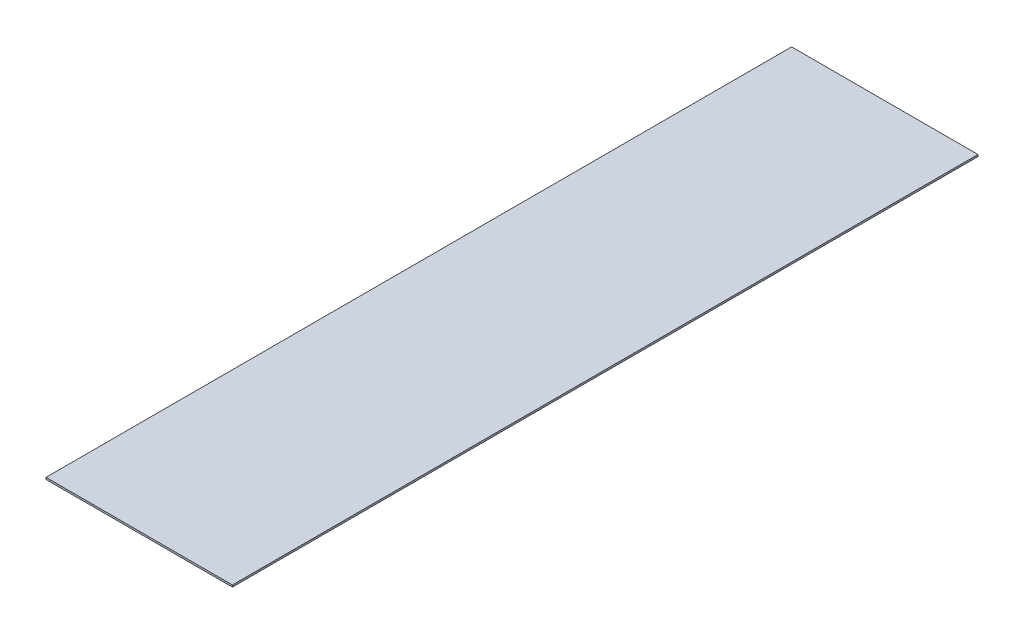
ISO-10303-21;
HEADER;
FILE_DESCRIPTION(('STEP AP214'),'2;1');
FILE_NAME('part.step','',(''),(''),'','','');
FILE_SCHEMA(('AUTOMOTIVE_DESIGN { 1 0 10303 214 1 1 1 1 }'));
ENDSEC;
DATA;
#1=APPLICATION_CONTEXT('core data for automotive mechanical design processes');
#2=APPLICATION_PROTOCOL_DEFINITION('international standard','automotive_design',2000,#1);
#3=PRODUCT_CONTEXT('',#1,'mechanical');
#4=PRODUCT('Part','Part','',(#3));
#5=PRODUCT_RELATED_PRODUCT_CATEGORY('part','',(#4));
#6=PRODUCT_DEFINITION_FORMATION('','',#4);
#7=PRODUCT_DEFINITION_CONTEXT('part definition',#1,'design');
#8=PRODUCT_DEFINITION('design','',#6,#7);
#9=PRODUCT_DEFINITION_SHAPE('','',#8);
#10=(LENGTH_UNIT() NAMED_UNIT(*) SI_UNIT(.MILLI.,.METRE.));
#11=(NAMED_UNIT(*) PLANE_ANGLE_UNIT() SI_UNIT($,.RADIAN.));
#12=(NAMED_UNIT(*) SI_UNIT($,.STERADIAN.) SOLID_ANGLE_UNIT());
#13=UNCERTAINTY_MEASURE_WITH_UNIT(LENGTH_MEASURE(1.E-05),#10,'distance_accuracy_value','');
#14=(GEOMETRIC_REPRESENTATION_CONTEXT(3) GLOBAL_UNCERTAINTY_ASSIGNED_CONTEXT((#13)) GLOBAL_UNIT_ASSIGNED_CONTEXT((#10,
#11,#12)) REPRESENTATION_CONTEXT('',''));
#15=CARTESIAN_POINT('',(0.,0.,0.));
#16=DIRECTION('',(0.,0.,1.));
#17=DIRECTION('',(1.,0.,0.));
#18=AXIS2_PLACEMENT_3D('',#15,#16,#17);
#19=CARTESIAN_POINT('',(0.,4.,0.));
#20=DIRECTION('',(-1.,0.,0.));
#21=DIRECTION('',(0.,0.,1.));
#22=AXIS2_PLACEMENT_3D('',#19,#20,#21);
#23=PLANE('',#22);
#24=DIRECTION('',(0.,0.,-1.));
#25=VECTOR('',#24,1.);
#26=CARTESIAN_POINT('',(0.,0.,0.));
#27=LINE('',#26,#25);
#28=CARTESIAN_POINT('',(0.,0.,0.));
#29=VERTEX_POINT('',#28);
#30=CARTESIAN_POINT('',(0.,0.,-1600.));
#31=VERTEX_POINT('',#30);
#32=EDGE_CURVE('E98',#29,#31,#27,.T.);
#33=ORIENTED_EDGE('',*,*,#32,.T.);
#34=DIRECTION('',(0.,-1.,0.));
#35=VECTOR('',#34,1.);
#36=CARTESIAN_POINT('',(0.,4.,-1600.));
#37=LINE('',#36,#35);
#38=CARTESIAN_POINT('',(0.,4.,-1600.));
#39=VERTEX_POINT('',#38);
#40=EDGE_CURVE('E11',#39,#31,#37,.T.);
#41=ORIENTED_EDGE('',*,*,#40,.F.);
#42=DIRECTION('',(0.,0.,-1.));
#43=VECTOR('',#42,1.);
#44=CARTESIAN_POINT('',(0.,4.,0.));
#45=LINE('',#44,#43);
#46=CARTESIAN_POINT('',(0.,4.,0.));
#47=VERTEX_POINT('',#46);
#48=EDGE_CURVE('E86',#47,#39,#45,.T.);
#49=ORIENTED_EDGE('',*,*,#48,.F.);
#50=DIRECTION('',(0.,-1.,0.));
#51=VECTOR('',#50,1.);
#52=CARTESIAN_POINT('',(0.,4.,0.));
#53=LINE('',#52,#51);
#54=EDGE_CURVE('E94',#47,#29,#53,.T.);
#55=ORIENTED_EDGE('',*,*,#54,.T.);
#56=EDGE_LOOP('',(#33,#41,#49,#55));
#57=FACE_BOUND('',#56,.T.);
#58=ADVANCED_FACE('F35',(#57),#23,.F.);
#59=CARTESIAN_POINT('',(0.,4.,-1600.));
#60=DIRECTION('',(0.,0.,1.));
#61=DIRECTION('',(1.,0.,0.));
#62=AXIS2_PLACEMENT_3D('',#59,#60,#61);
#63=PLANE('',#62);
#64=DIRECTION('',(-1.,0.,0.));
#65=VECTOR('',#64,1.);
#66=CARTESIAN_POINT('',(0.,0.,-1600.));
#67=LINE('',#66,#65);
#68=CARTESIAN_POINT('',(-400.,0.,-1600.));
#69=VERTEX_POINT('',#68);
#70=EDGE_CURVE('E90',#31,#69,#67,.T.);
#71=ORIENTED_EDGE('',*,*,#70,.T.);
#72=DIRECTION('',(0.,-1.,0.));
#73=VECTOR('',#72,1.);
#74=CARTESIAN_POINT('',(-400.,4.,-1600.));
#75=LINE('',#74,#73);
#76=CARTESIAN_POINT('',(-400.,4.,-1600.));
#77=VERTEX_POINT('',#76);
#78=EDGE_CURVE('E43',#77,#69,#75,.T.);
#79=ORIENTED_EDGE('',*,*,#78,.F.);
#80=DIRECTION('',(-1.,0.,0.));
#81=VECTOR('',#80,1.);
#82=CARTESIAN_POINT('',(0.,4.,-1600.));
#83=LINE('',#82,#81);
#84=EDGE_CURVE('E81',#39,#77,#83,.T.);
#85=ORIENTED_EDGE('',*,*,#84,.F.);
#86=ORIENTED_EDGE('',*,*,#40,.T.);
#87=EDGE_LOOP('',(#71,#79,#85,#86));
#88=FACE_BOUND('',#87,.T.);
#89=ADVANCED_FACE('F89',(#88),#63,.F.);
#90=CARTESIAN_POINT('',(-400.,4.,0.));
#91=DIRECTION('',(1.,0.,0.));
#92=DIRECTION('',(0.,0.,-1.));
#93=AXIS2_PLACEMENT_3D('',#90,#91,#92);
#94=PLANE('',#93);
#95=DIRECTION('',(0.,0.,1.));
#96=VECTOR('',#95,1.);
#97=CARTESIAN_POINT('',(-400.,0.,0.));
#98=LINE('',#97,#96);
#99=CARTESIAN_POINT('',(-400.,0.,0.));
#100=VERTEX_POINT('',#99);
#101=EDGE_CURVE('E68',#69,#100,#98,.T.);
#102=ORIENTED_EDGE('',*,*,#101,.T.);
#103=DIRECTION('',(0.,-1.,0.));
#104=VECTOR('',#103,1.);
#105=CARTESIAN_POINT('',(-400.,4.,0.));
#106=LINE('',#105,#104);
#107=CARTESIAN_POINT('',(-400.,4.,0.));
#108=VERTEX_POINT('',#107);
#109=EDGE_CURVE('E91',#108,#100,#106,.T.);
#110=ORIENTED_EDGE('',*,*,#109,.F.);
#111=DIRECTION('',(0.,0.,1.));
#112=VECTOR('',#111,1.);
#113=CARTESIAN_POINT('',(-400.,4.,0.));
#114=LINE('',#113,#112);
#115=EDGE_CURVE('E84',#77,#108,#114,.T.);
#116=ORIENTED_EDGE('',*,*,#115,.F.);
#117=ORIENTED_EDGE('',*,*,#78,.T.);
#118=EDGE_LOOP('',(#102,#110,#116,#117));
#119=FACE_BOUND('',#118,.T.);
#120=ADVANCED_FACE('F92',(#119),#94,.F.);
#121=CARTESIAN_POINT('',(0.,4.,0.));
#122=DIRECTION('',(0.,0.,-1.));
#123=DIRECTION('',(-1.,0.,0.));
#124=AXIS2_PLACEMENT_3D('',#121,#122,#123);
#125=PLANE('',#124);
#126=DIRECTION('',(1.,0.,0.));
#127=VECTOR('',#126,1.);
#128=CARTESIAN_POINT('',(0.,0.,0.));
#129=LINE('',#128,#127);
#130=EDGE_CURVE('E74',#100,#29,#129,.T.);
#131=ORIENTED_EDGE('',*,*,#130,.T.);
#132=ORIENTED_EDGE('',*,*,#54,.F.);
#133=DIRECTION('',(1.,0.,0.));
#134=VECTOR('',#133,1.);
#135=CARTESIAN_POINT('',(0.,4.,0.));
#136=LINE('',#135,#134);
#137=EDGE_CURVE('E51',#108,#47,#136,.T.);
#138=ORIENTED_EDGE('',*,*,#137,.F.);
#139=ORIENTED_EDGE('',*,*,#109,.T.);
#140=EDGE_LOOP('',(#131,#132,#138,#139));
#141=FACE_BOUND('',#140,.T.);
#142=ADVANCED_FACE('F105',(#141),#125,.F.);
#143=CARTESIAN_POINT('',(0.,4.,0.));
#144=DIRECTION('',(0.,1.,0.));
#145=DIRECTION('',(0.,0.,1.));
#146=AXIS2_PLACEMENT_3D('',#143,#144,#145);
#147=PLANE('',#146);
#148=ORIENTED_EDGE('',*,*,#48,.T.);
#149=ORIENTED_EDGE('',*,*,#84,.T.);
#150=ORIENTED_EDGE('',*,*,#115,.T.);
#151=ORIENTED_EDGE('',*,*,#137,.T.);
#152=EDGE_LOOP('',(#148,#149,#150,#151));
#153=FACE_BOUND('',#152,.T.);
#154=ADVANCED_FACE('F82',(#153),#147,.T.);
#155=CARTESIAN_POINT('',(0.,0.,0.));
#156=DIRECTION('',(0.,1.,0.));
#157=DIRECTION('',(0.,0.,1.));
#158=AXIS2_PLACEMENT_3D('',#155,#156,#157);
#159=PLANE('',#158);
#160=ORIENTED_EDGE('',*,*,#32,.F.);
#161=ORIENTED_EDGE('',*,*,#130,.F.);
#162=ORIENTED_EDGE('',*,*,#101,.F.);
#163=ORIENTED_EDGE('',*,*,#70,.F.);
#164=EDGE_LOOP('',(#160,#161,#162,#163));
#165=FACE_BOUND('',#164,.T.);
#166=ADVANCED_FACE('F108',(#165),#159,.F.);
#167=CLOSED_SHELL('',(#58,#89,#120,#142,#154,#166));
#168=MANIFOLD_SOLID_BREP('B2',#167);
#169=ADVANCED_BREP_SHAPE_REPRESENTATION('',(#18,#168),#14);
#170=SHAPE_DEFINITION_REPRESENTATION(#9,#169);
ENDSEC;
END-ISO-10303-21;
